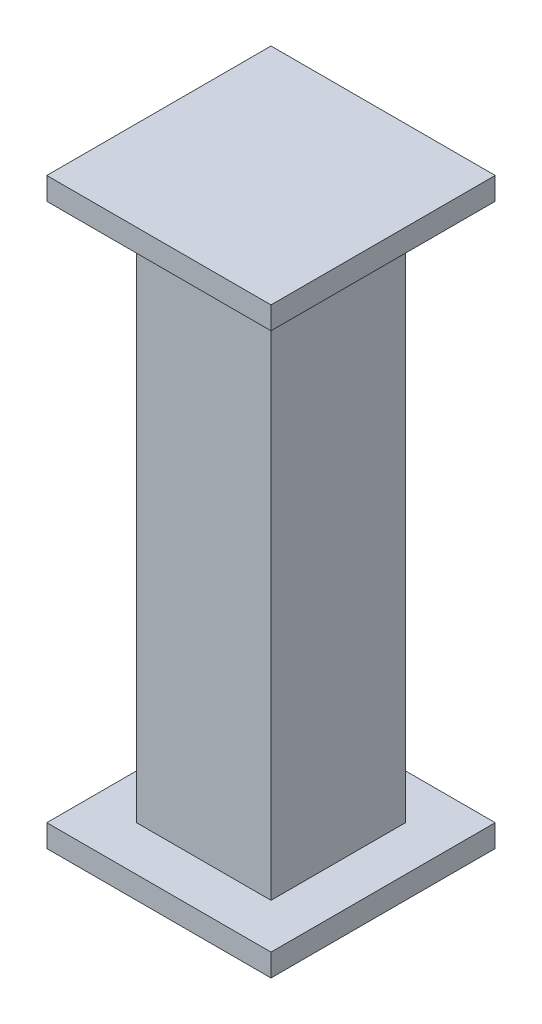
ISO-10303-21;
HEADER;
FILE_DESCRIPTION(('STEP AP214'),'2;1');
FILE_NAME('part.step','',(''),(''),'','','');
FILE_SCHEMA(('AUTOMOTIVE_DESIGN { 1 0 10303 214 1 1 1 1 }'));
ENDSEC;
DATA;
#1=APPLICATION_CONTEXT('core data for automotive mechanical design processes');
#2=APPLICATION_PROTOCOL_DEFINITION('international standard','automotive_design',2000,#1);
#3=PRODUCT_CONTEXT('',#1,'mechanical');
#4=PRODUCT('Part','Part','',(#3));
#5=PRODUCT_RELATED_PRODUCT_CATEGORY('part','',(#4));
#6=PRODUCT_DEFINITION_FORMATION('','',#4);
#7=PRODUCT_DEFINITION_CONTEXT('part definition',#1,'design');
#8=PRODUCT_DEFINITION('design','',#6,#7);
#9=PRODUCT_DEFINITION_SHAPE('','',#8);
#10=(LENGTH_UNIT() NAMED_UNIT(*) SI_UNIT(.MILLI.,.METRE.));
#11=(NAMED_UNIT(*) PLANE_ANGLE_UNIT() SI_UNIT($,.RADIAN.));
#12=(NAMED_UNIT(*) SI_UNIT($,.STERADIAN.) SOLID_ANGLE_UNIT());
#13=UNCERTAINTY_MEASURE_WITH_UNIT(LENGTH_MEASURE(1.E-05),#10,'distance_accuracy_value','');
#14=(GEOMETRIC_REPRESENTATION_CONTEXT(3) GLOBAL_UNCERTAINTY_ASSIGNED_CONTEXT((#13)) GLOBAL_UNIT_ASSIGNED_CONTEXT((#10,
#11,#12)) REPRESENTATION_CONTEXT('',''));
#15=CARTESIAN_POINT('',(0.,0.,0.));
#16=DIRECTION('',(0.,0.,1.));
#17=DIRECTION('',(1.,0.,0.));
#18=AXIS2_PLACEMENT_3D('',#15,#16,#17);
#19=CARTESIAN_POINT('',(6.,48.,-6.));
#20=DIRECTION('',(-1.,0.,0.));
#21=DIRECTION('',(0.,0.,1.));
#22=AXIS2_PLACEMENT_3D('',#19,#20,#21);
#23=PLANE('',#22);
#24=DIRECTION('',(0.,0.,-1.));
#25=VECTOR('',#24,1.);
#26=CARTESIAN_POINT('',(6.,0.,-6.));
#27=LINE('',#26,#25);
#28=CARTESIAN_POINT('',(6.,0.,6.));
#29=VERTEX_POINT('',#28);
#30=CARTESIAN_POINT('',(6.,0.,-6.));
#31=VERTEX_POINT('',#30);
#32=EDGE_CURVE('E256',#29,#31,#27,.T.);
#33=ORIENTED_EDGE('',*,*,#32,.T.);
#34=DIRECTION('',(0.,-1.,0.));
#35=VECTOR('',#34,1.);
#36=CARTESIAN_POINT('',(6.,48.,-6.));
#37=LINE('',#36,#35);
#38=CARTESIAN_POINT('',(6.,48.,-6.));
#39=VERTEX_POINT('',#38);
#40=EDGE_CURVE('E11',#39,#31,#37,.T.);
#41=ORIENTED_EDGE('',*,*,#40,.F.);
#42=DIRECTION('',(0.,0.,-1.));
#43=VECTOR('',#42,1.);
#44=CARTESIAN_POINT('',(6.,48.,-6.));
#45=LINE('',#44,#43);
#46=CARTESIAN_POINT('',(6.,48.,6.));
#47=VERTEX_POINT('',#46);
#48=EDGE_CURVE('E257',#47,#39,#45,.T.);
#49=ORIENTED_EDGE('',*,*,#48,.F.);
#50=DIRECTION('',(0.,-1.,0.));
#51=VECTOR('',#50,1.);
#52=CARTESIAN_POINT('',(6.,48.,6.));
#53=LINE('',#52,#51);
#54=EDGE_CURVE('E270',#47,#29,#53,.T.);
#55=ORIENTED_EDGE('',*,*,#54,.T.);
#56=EDGE_LOOP('',(#33,#41,#49,#55));
#57=FACE_BOUND('',#56,.T.);
#58=ADVANCED_FACE('F42',(#57),#23,.F.);
#59=CARTESIAN_POINT('',(-6.,48.,-6.));
#60=DIRECTION('',(0.,0.,1.));
#61=DIRECTION('',(1.,0.,0.));
#62=AXIS2_PLACEMENT_3D('',#59,#60,#61);
#63=PLANE('',#62);
#64=DIRECTION('',(-1.,0.,0.));
#65=VECTOR('',#64,1.);
#66=CARTESIAN_POINT('',(-6.,0.,-6.));
#67=LINE('',#66,#65);
#68=CARTESIAN_POINT('',(-6.,0.,-6.));
#69=VERTEX_POINT('',#68);
#70=EDGE_CURVE('E273',#31,#69,#67,.T.);
#71=ORIENTED_EDGE('',*,*,#70,.T.);
#72=DIRECTION('',(0.,-1.,0.));
#73=VECTOR('',#72,1.);
#74=CARTESIAN_POINT('',(-6.,48.,-6.));
#75=LINE('',#74,#73);
#76=CARTESIAN_POINT('',(-6.,48.,-6.));
#77=VERTEX_POINT('',#76);
#78=EDGE_CURVE('E50',#77,#69,#75,.T.);
#79=ORIENTED_EDGE('',*,*,#78,.F.);
#80=DIRECTION('',(-1.,0.,0.));
#81=VECTOR('',#80,1.);
#82=CARTESIAN_POINT('',(-6.,48.,-6.));
#83=LINE('',#82,#81);
#84=EDGE_CURVE('E260',#39,#77,#83,.T.);
#85=ORIENTED_EDGE('',*,*,#84,.F.);
#86=ORIENTED_EDGE('',*,*,#40,.T.);
#87=EDGE_LOOP('',(#71,#79,#85,#86));
#88=FACE_BOUND('',#87,.T.);
#89=ADVANCED_FACE('F283',(#88),#63,.F.);
#90=CARTESIAN_POINT('',(-6.,48.,-6.));
#91=DIRECTION('',(1.,0.,0.));
#92=DIRECTION('',(0.,0.,-1.));
#93=AXIS2_PLACEMENT_3D('',#90,#91,#92);
#94=PLANE('',#93);
#95=DIRECTION('',(0.,0.,1.));
#96=VECTOR('',#95,1.);
#97=CARTESIAN_POINT('',(-6.,0.,-6.));
#98=LINE('',#97,#96);
#99=CARTESIAN_POINT('',(-6.,0.,6.));
#100=VERTEX_POINT('',#99);
#101=EDGE_CURVE('E78',#69,#100,#98,.T.);
#102=ORIENTED_EDGE('',*,*,#101,.T.);
#103=DIRECTION('',(0.,-1.,0.));
#104=VECTOR('',#103,1.);
#105=CARTESIAN_POINT('',(-6.,48.,6.));
#106=LINE('',#105,#104);
#107=CARTESIAN_POINT('',(-6.,48.,6.));
#108=VERTEX_POINT('',#107);
#109=EDGE_CURVE('E66',#108,#100,#106,.T.);
#110=ORIENTED_EDGE('',*,*,#109,.F.);
#111=DIRECTION('',(0.,0.,1.));
#112=VECTOR('',#111,1.);
#113=CARTESIAN_POINT('',(-6.,48.,-6.));
#114=LINE('',#113,#112);
#115=EDGE_CURVE('E264',#77,#108,#114,.T.);
#116=ORIENTED_EDGE('',*,*,#115,.F.);
#117=ORIENTED_EDGE('',*,*,#78,.T.);
#118=EDGE_LOOP('',(#102,#110,#116,#117));
#119=FACE_BOUND('',#118,.T.);
#120=ADVANCED_FACE('F281',(#119),#94,.F.);
#121=CARTESIAN_POINT('',(-6.,48.,6.));
#122=DIRECTION('',(0.,0.,-1.));
#123=DIRECTION('',(-1.,0.,0.));
#124=AXIS2_PLACEMENT_3D('',#121,#122,#123);
#125=PLANE('',#124);
#126=DIRECTION('',(1.,0.,0.));
#127=VECTOR('',#126,1.);
#128=CARTESIAN_POINT('',(-6.,0.,6.));
#129=LINE('',#128,#127);
#130=EDGE_CURVE('E261',#100,#29,#129,.T.);
#131=ORIENTED_EDGE('',*,*,#130,.T.);
#132=ORIENTED_EDGE('',*,*,#54,.F.);
#133=DIRECTION('',(1.,0.,0.));
#134=VECTOR('',#133,1.);
#135=CARTESIAN_POINT('',(-6.,48.,6.));
#136=LINE('',#135,#134);
#137=EDGE_CURVE('E267',#108,#47,#136,.T.);
#138=ORIENTED_EDGE('',*,*,#137,.F.);
#139=ORIENTED_EDGE('',*,*,#109,.T.);
#140=EDGE_LOOP('',(#131,#132,#138,#139));
#141=FACE_BOUND('',#140,.T.);
#142=ADVANCED_FACE('F289',(#141),#125,.F.);
#143=CARTESIAN_POINT('',(0.,0.,0.));
#144=DIRECTION('',(0.,1.,0.));
#145=DIRECTION('',(0.,0.,1.));
#146=AXIS2_PLACEMENT_3D('',#143,#144,#145);
#147=PLANE('',#146);
#148=DIRECTION('',(0.,0.,-1.));
#149=VECTOR('',#148,1.);
#150=CARTESIAN_POINT('',(10.,0.,-10.));
#151=LINE('',#150,#149);
#152=CARTESIAN_POINT('',(10.,0.,10.));
#153=VERTEX_POINT('',#152);
#154=CARTESIAN_POINT('',(10.,0.,-10.));
#155=VERTEX_POINT('',#154);
#156=EDGE_CURVE('E190',#153,#155,#151,.T.);
#157=ORIENTED_EDGE('',*,*,#156,.T.);
#158=DIRECTION('',(-1.,0.,0.));
#159=VECTOR('',#158,1.);
#160=CARTESIAN_POINT('',(-10.,0.,-10.));
#161=LINE('',#160,#159);
#162=CARTESIAN_POINT('',(-10.,0.,-10.));
#163=VERTEX_POINT('',#162);
#164=EDGE_CURVE('E193',#155,#163,#161,.T.);
#165=ORIENTED_EDGE('',*,*,#164,.T.);
#166=DIRECTION('',(0.,0.,1.));
#167=VECTOR('',#166,1.);
#168=CARTESIAN_POINT('',(-10.,0.,-10.));
#169=LINE('',#168,#167);
#170=CARTESIAN_POINT('',(-10.,0.,10.));
#171=VERTEX_POINT('',#170);
#172=EDGE_CURVE('E215',#163,#171,#169,.T.);
#173=ORIENTED_EDGE('',*,*,#172,.T.);
#174=DIRECTION('',(1.,0.,0.));
#175=VECTOR('',#174,1.);
#176=CARTESIAN_POINT('',(-10.,0.,10.));
#177=LINE('',#176,#175);
#178=EDGE_CURVE('E203',#171,#153,#177,.T.);
#179=ORIENTED_EDGE('',*,*,#178,.T.);
#180=EDGE_LOOP('',(#157,#165,#173,#179));
#181=FACE_BOUND('',#180,.T.);
#182=ORIENTED_EDGE('',*,*,#32,.F.);
#183=ORIENTED_EDGE('',*,*,#130,.F.);
#184=ORIENTED_EDGE('',*,*,#101,.F.);
#185=ORIENTED_EDGE('',*,*,#70,.F.);
#186=EDGE_LOOP('',(#182,#183,#184,#185));
#187=FACE_BOUND('',#186,.T.);
#188=ADVANCED_FACE('F285',(#181,#187),#147,.T.);
#189=CARTESIAN_POINT('',(10.,-2.,-10.));
#190=DIRECTION('',(1.,0.,0.));
#191=DIRECTION('',(0.,0.,-1.));
#192=AXIS2_PLACEMENT_3D('',#189,#190,#191);
#193=PLANE('',#192);
#194=ORIENTED_EDGE('',*,*,#156,.F.);
#195=DIRECTION('',(0.,1.,0.));
#196=VECTOR('',#195,1.);
#197=CARTESIAN_POINT('',(10.,-2.,10.));
#198=LINE('',#197,#196);
#199=CARTESIAN_POINT('',(10.,-2.,10.));
#200=VERTEX_POINT('',#199);
#201=EDGE_CURVE('E220',#200,#153,#198,.T.);
#202=ORIENTED_EDGE('',*,*,#201,.F.);
#203=DIRECTION('',(0.,0.,-1.));
#204=VECTOR('',#203,1.);
#205=CARTESIAN_POINT('',(10.,-2.,-10.));
#206=LINE('',#205,#204);
#207=CARTESIAN_POINT('',(10.,-2.,-10.));
#208=VERTEX_POINT('',#207);
#209=EDGE_CURVE('E199',#200,#208,#206,.T.);
#210=ORIENTED_EDGE('',*,*,#209,.T.);
#211=DIRECTION('',(0.,1.,0.));
#212=VECTOR('',#211,1.);
#213=CARTESIAN_POINT('',(10.,-2.,-10.));
#214=LINE('',#213,#212);
#215=EDGE_CURVE('E211',#208,#155,#214,.T.);
#216=ORIENTED_EDGE('',*,*,#215,.T.);
#217=EDGE_LOOP('',(#194,#202,#210,#216));
#218=FACE_BOUND('',#217,.T.);
#219=ADVANCED_FACE('F336',(#218),#193,.T.);
#220=CARTESIAN_POINT('',(-10.,-2.,10.));
#221=DIRECTION('',(0.,0.,1.));
#222=DIRECTION('',(1.,0.,0.));
#223=AXIS2_PLACEMENT_3D('',#220,#221,#222);
#224=PLANE('',#223);
#225=ORIENTED_EDGE('',*,*,#178,.F.);
#226=DIRECTION('',(0.,1.,0.));
#227=VECTOR('',#226,1.);
#228=CARTESIAN_POINT('',(-10.,-2.,10.));
#229=LINE('',#228,#227);
#230=CARTESIAN_POINT('',(-10.,-2.,10.));
#231=VERTEX_POINT('',#230);
#232=EDGE_CURVE('E223',#231,#171,#229,.T.);
#233=ORIENTED_EDGE('',*,*,#232,.F.);
#234=DIRECTION('',(1.,0.,0.));
#235=VECTOR('',#234,1.);
#236=CARTESIAN_POINT('',(-10.,-2.,10.));
#237=LINE('',#236,#235);
#238=EDGE_CURVE('E209',#231,#200,#237,.T.);
#239=ORIENTED_EDGE('',*,*,#238,.T.);
#240=ORIENTED_EDGE('',*,*,#201,.T.);
#241=EDGE_LOOP('',(#225,#233,#239,#240));
#242=FACE_BOUND('',#241,.T.);
#243=ADVANCED_FACE('F339',(#242),#224,.T.);
#244=CARTESIAN_POINT('',(-10.,-2.,-10.));
#245=DIRECTION('',(-1.,0.,0.));
#246=DIRECTION('',(0.,0.,1.));
#247=AXIS2_PLACEMENT_3D('',#244,#245,#246);
#248=PLANE('',#247);
#249=ORIENTED_EDGE('',*,*,#172,.F.);
#250=DIRECTION('',(0.,1.,0.));
#251=VECTOR('',#250,1.);
#252=CARTESIAN_POINT('',(-10.,-2.,-10.));
#253=LINE('',#252,#251);
#254=CARTESIAN_POINT('',(-10.,-2.,-10.));
#255=VERTEX_POINT('',#254);
#256=EDGE_CURVE('E225',#255,#163,#253,.T.);
#257=ORIENTED_EDGE('',*,*,#256,.F.);
#258=DIRECTION('',(0.,0.,1.));
#259=VECTOR('',#258,1.);
#260=CARTESIAN_POINT('',(-10.,-2.,-10.));
#261=LINE('',#260,#259);
#262=EDGE_CURVE('E206',#255,#231,#261,.T.);
#263=ORIENTED_EDGE('',*,*,#262,.T.);
#264=ORIENTED_EDGE('',*,*,#232,.T.);
#265=EDGE_LOOP('',(#249,#257,#263,#264));
#266=FACE_BOUND('',#265,.T.);
#267=ADVANCED_FACE('F343',(#266),#248,.T.);
#268=CARTESIAN_POINT('',(-10.,-2.,-10.));
#269=DIRECTION('',(0.,0.,-1.));
#270=DIRECTION('',(-1.,0.,0.));
#271=AXIS2_PLACEMENT_3D('',#268,#269,#270);
#272=PLANE('',#271);
#273=ORIENTED_EDGE('',*,*,#164,.F.);
#274=ORIENTED_EDGE('',*,*,#215,.F.);
#275=DIRECTION('',(-1.,0.,0.));
#276=VECTOR('',#275,1.);
#277=CARTESIAN_POINT('',(-10.,-2.,-10.));
#278=LINE('',#277,#276);
#279=EDGE_CURVE('E202',#208,#255,#278,.T.);
#280=ORIENTED_EDGE('',*,*,#279,.T.);
#281=ORIENTED_EDGE('',*,*,#256,.T.);
#282=EDGE_LOOP('',(#273,#274,#280,#281));
#283=FACE_BOUND('',#282,.T.);
#284=ADVANCED_FACE('F302',(#283),#272,.T.);
#285=CARTESIAN_POINT('',(0.,-2.,0.));
#286=DIRECTION('',(0.,1.,0.));
#287=DIRECTION('',(0.,0.,1.));
#288=AXIS2_PLACEMENT_3D('',#285,#286,#287);
#289=PLANE('',#288);
#290=ORIENTED_EDGE('',*,*,#209,.F.);
#291=ORIENTED_EDGE('',*,*,#238,.F.);
#292=ORIENTED_EDGE('',*,*,#262,.F.);
#293=ORIENTED_EDGE('',*,*,#279,.F.);
#294=EDGE_LOOP('',(#290,#291,#292,#293));
#295=FACE_BOUND('',#294,.T.);
#296=ADVANCED_FACE('F293',(#295),#289,.F.);
#297=CARTESIAN_POINT('',(0.,48.,0.));
#298=DIRECTION('',(0.,1.,0.));
#299=DIRECTION('',(0.,0.,1.));
#300=AXIS2_PLACEMENT_3D('',#297,#298,#299);
#301=PLANE('',#300);
#302=DIRECTION('',(0.,0.,-1.));
#303=VECTOR('',#302,1.);
#304=CARTESIAN_POINT('',(10.,48.,-10.));
#305=LINE('',#304,#303);
#306=CARTESIAN_POINT('',(10.,48.,10.));
#307=VERTEX_POINT('',#306);
#308=CARTESIAN_POINT('',(10.,48.,-10.));
#309=VERTEX_POINT('',#308);
#310=EDGE_CURVE('E189',#307,#309,#305,.T.);
#311=ORIENTED_EDGE('',*,*,#310,.F.);
#312=DIRECTION('',(1.,0.,0.));
#313=VECTOR('',#312,1.);
#314=CARTESIAN_POINT('',(-10.,48.,10.));
#315=LINE('',#314,#313);
#316=CARTESIAN_POINT('',(-10.,48.,10.));
#317=VERTEX_POINT('',#316);
#318=EDGE_CURVE('E185',#317,#307,#315,.T.);
#319=ORIENTED_EDGE('',*,*,#318,.F.);
#320=DIRECTION('',(0.,0.,1.));
#321=VECTOR('',#320,1.);
#322=CARTESIAN_POINT('',(-10.,48.,-10.));
#323=LINE('',#322,#321);
#324=CARTESIAN_POINT('',(-10.,48.,-10.));
#325=VERTEX_POINT('',#324);
#326=EDGE_CURVE('E370',#325,#317,#323,.T.);
#327=ORIENTED_EDGE('',*,*,#326,.F.);
#328=DIRECTION('',(-1.,0.,0.));
#329=VECTOR('',#328,1.);
#330=CARTESIAN_POINT('',(-10.,48.,-10.));
#331=LINE('',#330,#329);
#332=EDGE_CURVE('E373',#309,#325,#331,.T.);
#333=ORIENTED_EDGE('',*,*,#332,.F.);
#334=EDGE_LOOP('',(#311,#319,#327,#333));
#335=FACE_BOUND('',#334,.T.);
#336=ORIENTED_EDGE('',*,*,#137,.T.);
#337=ORIENTED_EDGE('',*,*,#48,.T.);
#338=ORIENTED_EDGE('',*,*,#84,.T.);
#339=ORIENTED_EDGE('',*,*,#115,.T.);
#340=EDGE_LOOP('',(#336,#337,#338,#339));
#341=FACE_BOUND('',#340,.T.);
#342=ADVANCED_FACE('F291',(#335,#341),#301,.F.);
#343=CARTESIAN_POINT('',(10.,50.,-10.));
#344=DIRECTION('',(-1.,0.,0.));
#345=DIRECTION('',(0.,0.,1.));
#346=AXIS2_PLACEMENT_3D('',#343,#344,#345);
#347=PLANE('',#346);
#348=ORIENTED_EDGE('',*,*,#310,.T.);
#349=DIRECTION('',(0.,-1.,0.));
#350=VECTOR('',#349,1.);
#351=CARTESIAN_POINT('',(10.,50.,-10.));
#352=LINE('',#351,#350);
#353=CARTESIAN_POINT('',(10.,50.,-10.));
#354=VERTEX_POINT('',#353);
#355=EDGE_CURVE('E169',#354,#309,#352,.T.);
#356=ORIENTED_EDGE('',*,*,#355,.F.);
#357=DIRECTION('',(0.,0.,-1.));
#358=VECTOR('',#357,1.);
#359=CARTESIAN_POINT('',(10.,50.,-10.));
#360=LINE('',#359,#358);
#361=CARTESIAN_POINT('',(10.,50.,10.));
#362=VERTEX_POINT('',#361);
#363=EDGE_CURVE('E176',#362,#354,#360,.T.);
#364=ORIENTED_EDGE('',*,*,#363,.F.);
#365=DIRECTION('',(0.,-1.,0.));
#366=VECTOR('',#365,1.);
#367=CARTESIAN_POINT('',(10.,50.,10.));
#368=LINE('',#367,#366);
#369=EDGE_CURVE('E367',#362,#307,#368,.T.);
#370=ORIENTED_EDGE('',*,*,#369,.T.);
#371=EDGE_LOOP('',(#348,#356,#364,#370));
#372=FACE_BOUND('',#371,.T.);
#373=ADVANCED_FACE('F187',(#372),#347,.F.);
#374=CARTESIAN_POINT('',(-10.,50.,-10.));
#375=DIRECTION('',(0.,0.,1.));
#376=DIRECTION('',(1.,0.,0.));
#377=AXIS2_PLACEMENT_3D('',#374,#375,#376);
#378=PLANE('',#377);
#379=ORIENTED_EDGE('',*,*,#332,.T.);
#380=DIRECTION('',(0.,-1.,0.));
#381=VECTOR('',#380,1.);
#382=CARTESIAN_POINT('',(-10.,50.,-10.));
#383=LINE('',#382,#381);
#384=CARTESIAN_POINT('',(-10.,50.,-10.));
#385=VERTEX_POINT('',#384);
#386=EDGE_CURVE('E172',#385,#325,#383,.T.);
#387=ORIENTED_EDGE('',*,*,#386,.F.);
#388=DIRECTION('',(-1.,0.,0.));
#389=VECTOR('',#388,1.);
#390=CARTESIAN_POINT('',(-10.,50.,-10.));
#391=LINE('',#390,#389);
#392=EDGE_CURVE('E165',#354,#385,#391,.T.);
#393=ORIENTED_EDGE('',*,*,#392,.F.);
#394=ORIENTED_EDGE('',*,*,#355,.T.);
#395=EDGE_LOOP('',(#379,#387,#393,#394));
#396=FACE_BOUND('',#395,.T.);
#397=ADVANCED_FACE('F167',(#396),#378,.F.);
#398=CARTESIAN_POINT('',(-10.,50.,-10.));
#399=DIRECTION('',(1.,0.,0.));
#400=DIRECTION('',(0.,0.,-1.));
#401=AXIS2_PLACEMENT_3D('',#398,#399,#400);
#402=PLANE('',#401);
#403=ORIENTED_EDGE('',*,*,#326,.T.);
#404=DIRECTION('',(0.,-1.,0.));
#405=VECTOR('',#404,1.);
#406=CARTESIAN_POINT('',(-10.,50.,10.));
#407=LINE('',#406,#405);
#408=CARTESIAN_POINT('',(-10.,50.,10.));
#409=VERTEX_POINT('',#408);
#410=EDGE_CURVE('E195',#409,#317,#407,.T.);
#411=ORIENTED_EDGE('',*,*,#410,.F.);
#412=DIRECTION('',(0.,0.,1.));
#413=VECTOR('',#412,1.);
#414=CARTESIAN_POINT('',(-10.,50.,-10.));
#415=LINE('',#414,#413);
#416=EDGE_CURVE('E175',#385,#409,#415,.T.);
#417=ORIENTED_EDGE('',*,*,#416,.F.);
#418=ORIENTED_EDGE('',*,*,#386,.T.);
#419=EDGE_LOOP('',(#403,#411,#417,#418));
#420=FACE_BOUND('',#419,.T.);
#421=ADVANCED_FACE('F356',(#420),#402,.F.);
#422=CARTESIAN_POINT('',(-10.,50.,10.));
#423=DIRECTION('',(0.,0.,-1.));
#424=DIRECTION('',(-1.,0.,0.));
#425=AXIS2_PLACEMENT_3D('',#422,#423,#424);
#426=PLANE('',#425);
#427=ORIENTED_EDGE('',*,*,#318,.T.);
#428=ORIENTED_EDGE('',*,*,#369,.F.);
#429=DIRECTION('',(1.,0.,0.));
#430=VECTOR('',#429,1.);
#431=CARTESIAN_POINT('',(-10.,50.,10.));
#432=LINE('',#431,#430);
#433=EDGE_CURVE('E181',#409,#362,#432,.T.);
#434=ORIENTED_EDGE('',*,*,#433,.F.);
#435=ORIENTED_EDGE('',*,*,#410,.T.);
#436=EDGE_LOOP('',(#427,#428,#434,#435));
#437=FACE_BOUND('',#436,.T.);
#438=ADVANCED_FACE('F358',(#437),#426,.F.);
#439=CARTESIAN_POINT('',(0.,50.,0.));
#440=DIRECTION('',(0.,1.,0.));
#441=DIRECTION('',(0.,0.,1.));
#442=AXIS2_PLACEMENT_3D('',#439,#440,#441);
#443=PLANE('',#442);
#444=ORIENTED_EDGE('',*,*,#363,.T.);
#445=ORIENTED_EDGE('',*,*,#392,.T.);
#446=ORIENTED_EDGE('',*,*,#416,.T.);
#447=ORIENTED_EDGE('',*,*,#433,.T.);
#448=EDGE_LOOP('',(#444,#445,#446,#447));
#449=FACE_BOUND('',#448,.T.);
#450=ADVANCED_FACE('F179',(#449),#443,.T.);
#451=CLOSED_SHELL('',(#58,#89,#120,#142,#188,#219,#243,#267,#284,#296,#342,#373,#397,#421,#438,#450));
#452=DIRECTION('',(1.,0.,0.));
#453=VECTOR('',#452,1.);
#454=CARTESIAN_POINT('',(-4.5,0.,4.5));
#455=LINE('',#454,#453);
#456=CARTESIAN_POINT('',(-4.5,0.,4.5));
#457=VERTEX_POINT('',#456);
#458=CARTESIAN_POINT('',(4.5,0.,4.5));
#459=VERTEX_POINT('',#458);
#460=EDGE_CURVE('E232',#457,#459,#455,.T.);
#461=ORIENTED_EDGE('',*,*,#460,.T.);
#462=DIRECTION('',(0.,0.,-1.));
#463=VECTOR('',#462,1.);
#464=CARTESIAN_POINT('',(4.5,0.,-4.5));
#465=LINE('',#464,#463);
#466=CARTESIAN_POINT('',(4.5,0.,-4.5));
#467=VERTEX_POINT('',#466);
#468=EDGE_CURVE('E222',#459,#467,#465,.T.);
#469=ORIENTED_EDGE('',*,*,#468,.T.);
#470=DIRECTION('',(-1.,0.,0.));
#471=VECTOR('',#470,1.);
#472=CARTESIAN_POINT('',(-4.5,0.,-4.5));
#473=LINE('',#472,#471);
#474=CARTESIAN_POINT('',(-4.5,0.,-4.5));
#475=VERTEX_POINT('',#474);
#476=EDGE_CURVE('E241',#467,#475,#473,.T.);
#477=ORIENTED_EDGE('',*,*,#476,.T.);
#478=DIRECTION('',(0.,0.,1.));
#479=VECTOR('',#478,1.);
#480=CARTESIAN_POINT('',(-4.5,0.,-4.5));
#481=LINE('',#480,#479);
#482=EDGE_CURVE('E244',#475,#457,#481,.T.);
#483=ORIENTED_EDGE('',*,*,#482,.T.);
#484=EDGE_LOOP('',(#461,#469,#477,#483));
#485=FACE_BOUND('',#484,.T.);
#486=ADVANCED_FACE('F332',(#485),#147,.T.);
#487=CARTESIAN_POINT('',(-4.5,48.,-4.5));
#488=DIRECTION('',(1.,0.,0.));
#489=DIRECTION('',(0.,0.,-1.));
#490=AXIS2_PLACEMENT_3D('',#487,#488,#489);
#491=PLANE('',#490);
#492=ORIENTED_EDGE('',*,*,#482,.F.);
#493=DIRECTION('',(0.,-1.,0.));
#494=VECTOR('',#493,1.);
#495=CARTESIAN_POINT('',(-4.5,48.,-4.5));
#496=LINE('',#495,#494);
#497=CARTESIAN_POINT('',(-4.5,48.,-4.5));
#498=VERTEX_POINT('',#497);
#499=EDGE_CURVE('E251',#498,#475,#496,.T.);
#500=ORIENTED_EDGE('',*,*,#499,.F.);
#501=DIRECTION('',(0.,0.,1.));
#502=VECTOR('',#501,1.);
#503=CARTESIAN_POINT('',(-4.5,48.,-4.5));
#504=LINE('',#503,#502);
#505=CARTESIAN_POINT('',(-4.5,48.,4.5));
#506=VERTEX_POINT('',#505);
#507=EDGE_CURVE('E235',#498,#506,#504,.T.);
#508=ORIENTED_EDGE('',*,*,#507,.T.);
#509=DIRECTION('',(0.,-1.,0.));
#510=VECTOR('',#509,1.);
#511=CARTESIAN_POINT('',(-4.5,48.,4.5));
#512=LINE('',#511,#510);
#513=EDGE_CURVE('E87',#506,#457,#512,.T.);
#514=ORIENTED_EDGE('',*,*,#513,.T.);
#515=EDGE_LOOP('',(#492,#500,#508,#514));
#516=FACE_BOUND('',#515,.T.);
#517=ADVANCED_FACE('F329',(#516),#491,.T.);
#518=CARTESIAN_POINT('',(-4.5,48.,4.5));
#519=DIRECTION('',(0.,0.,-1.));
#520=DIRECTION('',(-1.,0.,0.));
#521=AXIS2_PLACEMENT_3D('',#518,#519,#520);
#522=PLANE('',#521);
#523=ORIENTED_EDGE('',*,*,#460,.F.);
#524=ORIENTED_EDGE('',*,*,#513,.F.);
#525=DIRECTION('',(1.,0.,0.));
#526=VECTOR('',#525,1.);
#527=CARTESIAN_POINT('',(-4.5,48.,4.5));
#528=LINE('',#527,#526);
#529=CARTESIAN_POINT('',(4.5,48.,4.5));
#530=VERTEX_POINT('',#529);
#531=EDGE_CURVE('E57',#506,#530,#528,.T.);
#532=ORIENTED_EDGE('',*,*,#531,.T.);
#533=DIRECTION('',(0.,-1.,0.));
#534=VECTOR('',#533,1.);
#535=CARTESIAN_POINT('',(4.5,48.,4.5));
#536=LINE('',#535,#534);
#537=EDGE_CURVE('E238',#530,#459,#536,.T.);
#538=ORIENTED_EDGE('',*,*,#537,.T.);
#539=EDGE_LOOP('',(#523,#524,#532,#538));
#540=FACE_BOUND('',#539,.T.);
#541=ADVANCED_FACE('F324',(#540),#522,.T.);
#542=CARTESIAN_POINT('',(4.5,48.,-4.5));
#543=DIRECTION('',(-1.,0.,0.));
#544=DIRECTION('',(0.,0.,1.));
#545=AXIS2_PLACEMENT_3D('',#542,#543,#544);
#546=PLANE('',#545);
#547=ORIENTED_EDGE('',*,*,#468,.F.);
#548=ORIENTED_EDGE('',*,*,#537,.F.);
#549=DIRECTION('',(0.,0.,-1.));
#550=VECTOR('',#549,1.);
#551=CARTESIAN_POINT('',(4.5,48.,-4.5));
#552=LINE('',#551,#550);
#553=CARTESIAN_POINT('',(4.5,48.,-4.5));
#554=VERTEX_POINT('',#553);
#555=EDGE_CURVE('E228',#530,#554,#552,.T.);
#556=ORIENTED_EDGE('',*,*,#555,.T.);
#557=DIRECTION('',(0.,-1.,0.));
#558=VECTOR('',#557,1.);
#559=CARTESIAN_POINT('',(4.5,48.,-4.5));
#560=LINE('',#559,#558);
#561=EDGE_CURVE('E253',#554,#467,#560,.T.);
#562=ORIENTED_EDGE('',*,*,#561,.T.);
#563=EDGE_LOOP('',(#547,#548,#556,#562));
#564=FACE_BOUND('',#563,.T.);
#565=ADVANCED_FACE('F321',(#564),#546,.T.);
#566=CARTESIAN_POINT('',(-4.5,48.,-4.5));
#567=DIRECTION('',(0.,0.,1.));
#568=DIRECTION('',(1.,0.,0.));
#569=AXIS2_PLACEMENT_3D('',#566,#567,#568);
#570=PLANE('',#569);
#571=ORIENTED_EDGE('',*,*,#476,.F.);
#572=ORIENTED_EDGE('',*,*,#561,.F.);
#573=DIRECTION('',(-1.,0.,0.));
#574=VECTOR('',#573,1.);
#575=CARTESIAN_POINT('',(-4.5,48.,-4.5));
#576=LINE('',#575,#574);
#577=EDGE_CURVE('E231',#554,#498,#576,.T.);
#578=ORIENTED_EDGE('',*,*,#577,.T.);
#579=ORIENTED_EDGE('',*,*,#499,.T.);
#580=EDGE_LOOP('',(#571,#572,#578,#579));
#581=FACE_BOUND('',#580,.T.);
#582=ADVANCED_FACE('F308',(#581),#570,.T.);
#583=ORIENTED_EDGE('',*,*,#577,.F.);
#584=ORIENTED_EDGE('',*,*,#555,.F.);
#585=ORIENTED_EDGE('',*,*,#531,.F.);
#586=ORIENTED_EDGE('',*,*,#507,.F.);
#587=EDGE_LOOP('',(#583,#584,#585,#586));
#588=FACE_BOUND('',#587,.T.);
#589=ADVANCED_FACE('F296',(#588),#301,.F.);
#590=CLOSED_SHELL('',(#486,#517,#541,#565,#582,#589));
#591=ORIENTED_CLOSED_SHELL('',*,#590,.T.);
#592=BREP_WITH_VOIDS('B2',#451,(#591));
#593=ADVANCED_BREP_SHAPE_REPRESENTATION('',(#18,#592),#14);
#594=SHAPE_DEFINITION_REPRESENTATION(#9,#593);
ENDSEC;
END-ISO-10303-21;
